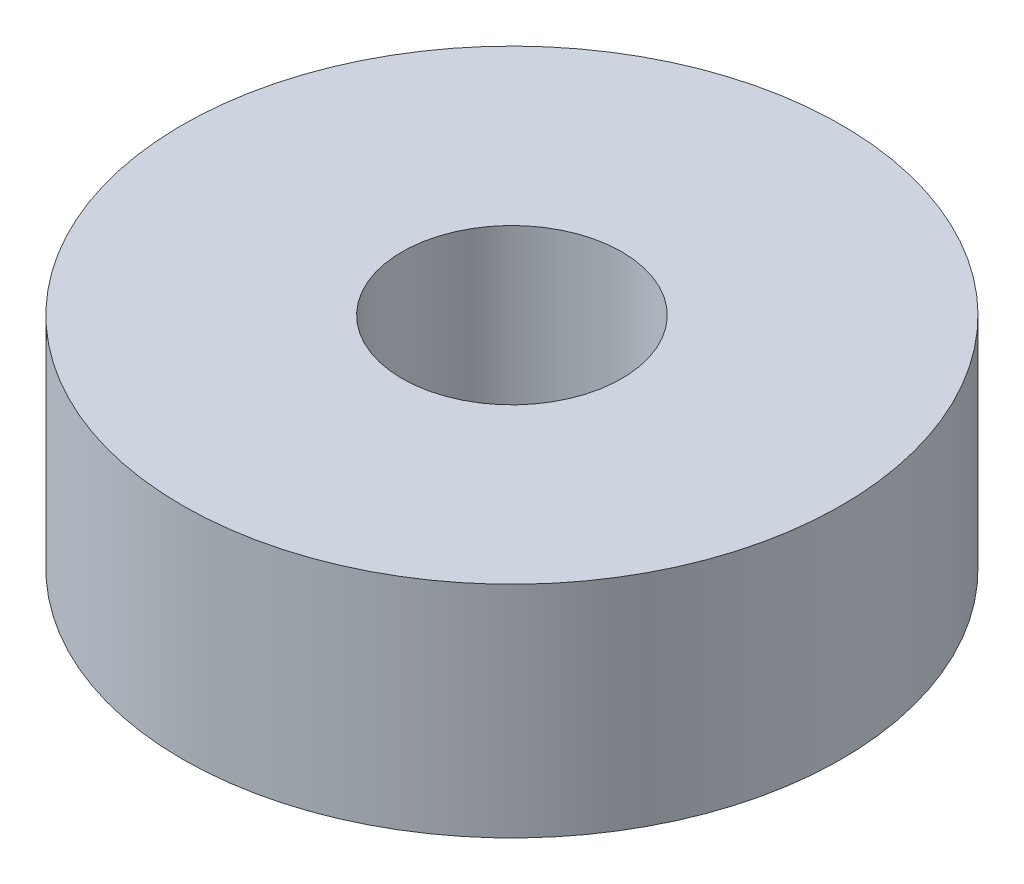
ISO-10303-21;
HEADER;
FILE_DESCRIPTION(('STEP AP214'),'2;1');
FILE_NAME('part.step','',(''),(''),'','','');
FILE_SCHEMA(('AUTOMOTIVE_DESIGN { 1 0 10303 214 1 1 1 1 }'));
ENDSEC;
DATA;
#1=APPLICATION_CONTEXT('core data for automotive mechanical design processes');
#2=APPLICATION_PROTOCOL_DEFINITION('international standard','automotive_design',2000,#1);
#3=PRODUCT_CONTEXT('',#1,'mechanical');
#4=PRODUCT('Part','Part','',(#3));
#5=PRODUCT_RELATED_PRODUCT_CATEGORY('part','',(#4));
#6=PRODUCT_DEFINITION_FORMATION('','',#4);
#7=PRODUCT_DEFINITION_CONTEXT('part definition',#1,'design');
#8=PRODUCT_DEFINITION('design','',#6,#7);
#9=PRODUCT_DEFINITION_SHAPE('','',#8);
#10=(LENGTH_UNIT() NAMED_UNIT(*) SI_UNIT(.MILLI.,.METRE.));
#11=(NAMED_UNIT(*) PLANE_ANGLE_UNIT() SI_UNIT($,.RADIAN.));
#12=(NAMED_UNIT(*) SI_UNIT($,.STERADIAN.) SOLID_ANGLE_UNIT());
#13=UNCERTAINTY_MEASURE_WITH_UNIT(LENGTH_MEASURE(1.E-05),#10,'distance_accuracy_value','');
#14=(GEOMETRIC_REPRESENTATION_CONTEXT(3) GLOBAL_UNCERTAINTY_ASSIGNED_CONTEXT((#13)) GLOBAL_UNIT_ASSIGNED_CONTEXT((#10,
#11,#12)) REPRESENTATION_CONTEXT('',''));
#15=CARTESIAN_POINT('',(0.,0.,0.));
#16=DIRECTION('',(0.,0.,1.));
#17=DIRECTION('',(1.,0.,0.));
#18=AXIS2_PLACEMENT_3D('',#15,#16,#17);
#19=CARTESIAN_POINT('',(0.,10.,0.));
#20=DIRECTION('',(0.,1.,0.));
#21=DIRECTION('',(0.,0.,1.));
#22=AXIS2_PLACEMENT_3D('',#19,#20,#21);
#23=PLANE('',#22);
#24=CARTESIAN_POINT('',(0.,10.,0.));
#25=DIRECTION('',(0.,1.,0.));
#26=DIRECTION('',(0.,0.,1.));
#27=AXIS2_PLACEMENT_3D('',#24,#25,#26);
#28=CIRCLE('',#27,15.);
#29=CARTESIAN_POINT('',(0.,10.,15.));
#30=VERTEX_POINT('',#29);
#31=EDGE_CURVE('E10',#30,#30,#28,.T.);
#32=ORIENTED_EDGE('',*,*,#31,.T.);
#33=EDGE_LOOP('',(#32));
#34=FACE_BOUND('',#33,.T.);
#35=CARTESIAN_POINT('',(0.,10.,0.));
#36=DIRECTION('',(0.,1.,0.));
#37=DIRECTION('',(0.,0.,1.));
#38=AXIS2_PLACEMENT_3D('',#35,#36,#37);
#39=CIRCLE('',#38,5.);
#40=CARTESIAN_POINT('',(0.,10.,5.));
#41=VERTEX_POINT('',#40);
#42=EDGE_CURVE('E43',#41,#41,#39,.T.);
#43=ORIENTED_EDGE('',*,*,#42,.F.);
#44=EDGE_LOOP('',(#43));
#45=FACE_BOUND('',#44,.T.);
#46=ADVANCED_FACE('F32',(#34,#45),#23,.T.);
#47=CARTESIAN_POINT('',(0.,0.,0.));
#48=DIRECTION('',(0.,1.,0.));
#49=DIRECTION('',(0.,0.,1.));
#50=AXIS2_PLACEMENT_3D('',#47,#48,#49);
#51=PLANE('',#50);
#52=CARTESIAN_POINT('',(0.,0.,0.));
#53=DIRECTION('',(0.,1.,0.));
#54=DIRECTION('',(0.,0.,1.));
#55=AXIS2_PLACEMENT_3D('',#52,#53,#54);
#56=CIRCLE('',#55,15.);
#57=CARTESIAN_POINT('',(0.,0.,15.));
#58=VERTEX_POINT('',#57);
#59=EDGE_CURVE('E36',#58,#58,#56,.T.);
#60=ORIENTED_EDGE('',*,*,#59,.F.);
#61=EDGE_LOOP('',(#60));
#62=FACE_BOUND('',#61,.T.);
#63=CARTESIAN_POINT('',(0.,0.,0.));
#64=DIRECTION('',(0.,1.,0.));
#65=DIRECTION('',(0.,0.,1.));
#66=AXIS2_PLACEMENT_3D('',#63,#64,#65);
#67=CIRCLE('',#66,5.);
#68=CARTESIAN_POINT('',(0.,0.,5.));
#69=VERTEX_POINT('',#68);
#70=EDGE_CURVE('E45',#69,#69,#67,.T.);
#71=ORIENTED_EDGE('',*,*,#70,.T.);
#72=EDGE_LOOP('',(#71));
#73=FACE_BOUND('',#72,.T.);
#74=ADVANCED_FACE('F55',(#62,#73),#51,.F.);
#75=CARTESIAN_POINT('',(0.,10.,0.));
#76=DIRECTION('',(0.,-1.,0.));
#77=DIRECTION('',(0.,0.,-1.));
#78=AXIS2_PLACEMENT_3D('',#75,#76,#77);
#79=CYLINDRICAL_SURFACE('',#78,15.);
#80=ORIENTED_EDGE('',*,*,#31,.F.);
#81=EDGE_LOOP('',(#80));
#82=FACE_BOUND('',#81,.T.);
#83=ORIENTED_EDGE('',*,*,#59,.T.);
#84=EDGE_LOOP('',(#83));
#85=FACE_BOUND('',#84,.T.);
#86=ADVANCED_FACE('F34',(#82,#85),#79,.T.);
#87=CARTESIAN_POINT('',(0.,10.,0.));
#88=DIRECTION('',(0.,-1.,0.));
#89=DIRECTION('',(0.,0.,-1.));
#90=AXIS2_PLACEMENT_3D('',#87,#88,#89);
#91=CYLINDRICAL_SURFACE('',#90,5.);
#92=ORIENTED_EDGE('',*,*,#42,.T.);
#93=EDGE_LOOP('',(#92));
#94=FACE_BOUND('',#93,.T.);
#95=ORIENTED_EDGE('',*,*,#70,.F.);
#96=EDGE_LOOP('',(#95));
#97=FACE_BOUND('',#96,.T.);
#98=ADVANCED_FACE('F51',(#94,#97),#91,.F.);
#99=CLOSED_SHELL('',(#46,#74,#86,#98));
#100=MANIFOLD_SOLID_BREP('B2',#99);
#101=ADVANCED_BREP_SHAPE_REPRESENTATION('',(#18,#100),#14);
#102=SHAPE_DEFINITION_REPRESENTATION(#9,#101);
ENDSEC;
END-ISO-10303-21;
